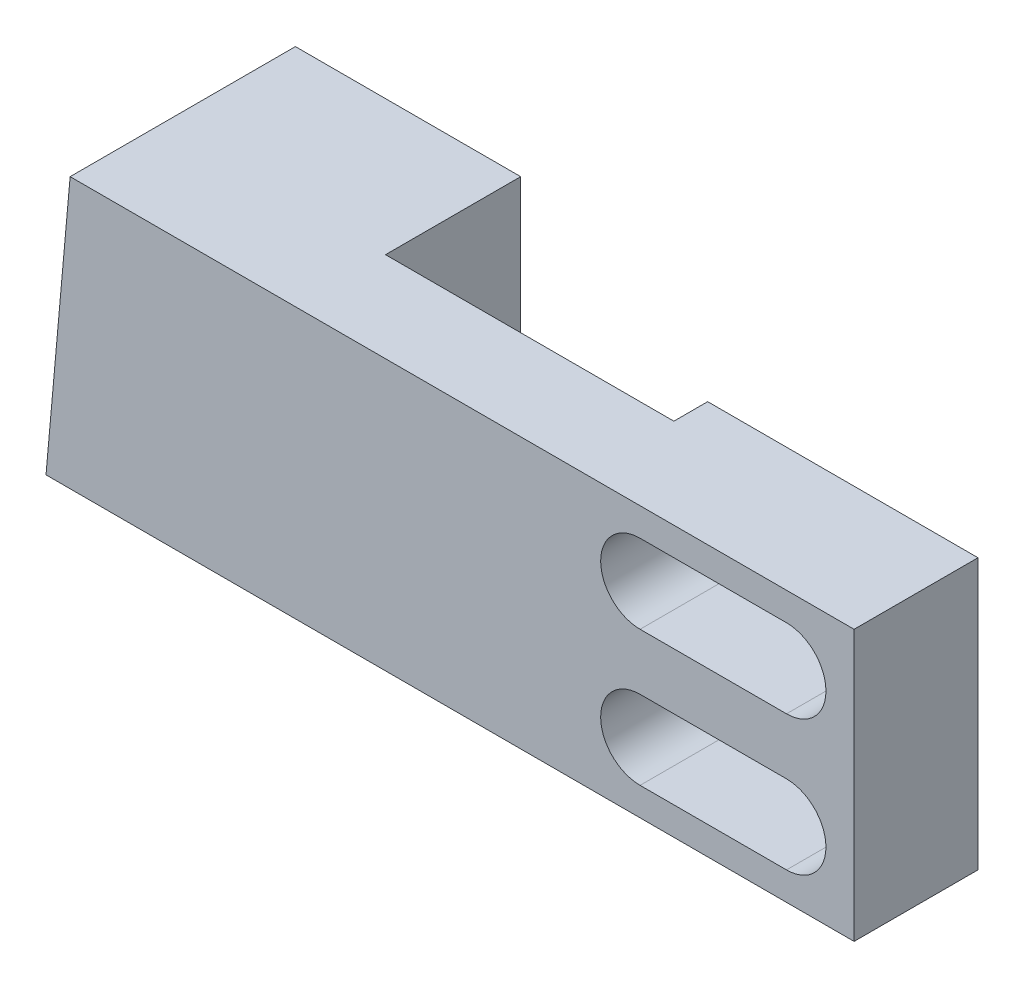
ISO-10303-21;
HEADER;
FILE_DESCRIPTION(('STEP AP214'),'2;1');
FILE_NAME('part.step','',(''),(''),'','','');
FILE_SCHEMA(('AUTOMOTIVE_DESIGN { 1 0 10303 214 1 1 1 1 }'));
ENDSEC;
DATA;
#1=APPLICATION_CONTEXT('core data for automotive mechanical design processes');
#2=APPLICATION_PROTOCOL_DEFINITION('international standard','automotive_design',2000,#1);
#3=PRODUCT_CONTEXT('',#1,'mechanical');
#4=PRODUCT('Part','Part','',(#3));
#5=PRODUCT_RELATED_PRODUCT_CATEGORY('part','',(#4));
#6=PRODUCT_DEFINITION_FORMATION('','',#4);
#7=PRODUCT_DEFINITION_CONTEXT('part definition',#1,'design');
#8=PRODUCT_DEFINITION('design','',#6,#7);
#9=PRODUCT_DEFINITION_SHAPE('','',#8);
#10=(LENGTH_UNIT() NAMED_UNIT(*) SI_UNIT(.MILLI.,.METRE.));
#11=(NAMED_UNIT(*) PLANE_ANGLE_UNIT() SI_UNIT($,.RADIAN.));
#12=(NAMED_UNIT(*) SI_UNIT($,.STERADIAN.) SOLID_ANGLE_UNIT());
#13=UNCERTAINTY_MEASURE_WITH_UNIT(LENGTH_MEASURE(1.E-05),#10,'distance_accuracy_value','');
#14=(GEOMETRIC_REPRESENTATION_CONTEXT(3) GLOBAL_UNCERTAINTY_ASSIGNED_CONTEXT((#13)) GLOBAL_UNIT_ASSIGNED_CONTEXT((#10,
#11,#12)) REPRESENTATION_CONTEXT('',''));
#15=CARTESIAN_POINT('',(0.,0.,0.));
#16=DIRECTION('',(0.,0.,1.));
#17=DIRECTION('',(1.,0.,0.));
#18=AXIS2_PLACEMENT_3D('',#15,#16,#17);
#19=CARTESIAN_POINT('',(0.,0.,6.));
#20=DIRECTION('',(0.,0.,1.));
#21=DIRECTION('',(1.,0.,0.));
#22=AXIS2_PLACEMENT_3D('',#19,#20,#21);
#23=PLANE('',#22);
#24=DIRECTION('',(0.,1.,0.));
#25=VECTOR('',#24,1.);
#26=CARTESIAN_POINT('',(12.8,12.,6.));
#27=LINE('',#26,#25);
#28=CARTESIAN_POINT('',(12.8,0.,6.));
#29=VERTEX_POINT('',#28);
#30=CARTESIAN_POINT('',(12.8,12.,6.));
#31=VERTEX_POINT('',#30);
#32=EDGE_CURVE('E190',#29,#31,#27,.T.);
#33=ORIENTED_EDGE('',*,*,#32,.F.);
#34=DIRECTION('',(1.,0.,0.));
#35=VECTOR('',#34,1.);
#36=CARTESIAN_POINT('',(0.,0.,6.));
#37=LINE('',#36,#35);
#38=CARTESIAN_POINT('',(0.,0.,6.));
#39=VERTEX_POINT('',#38);
#40=EDGE_CURVE('E222',#39,#29,#37,.T.);
#41=ORIENTED_EDGE('',*,*,#40,.F.);
#42=DIRECTION('',(0.,-1.,0.));
#43=VECTOR('',#42,1.);
#44=CARTESIAN_POINT('',(0.,12.,6.));
#45=LINE('',#44,#43);
#46=CARTESIAN_POINT('',(0.,12.,6.));
#47=VERTEX_POINT('',#46);
#48=EDGE_CURVE('E218',#47,#39,#45,.T.);
#49=ORIENTED_EDGE('',*,*,#48,.F.);
#50=DIRECTION('',(-1.,0.,0.));
#51=VECTOR('',#50,1.);
#52=CARTESIAN_POINT('',(0.,12.,6.));
#53=LINE('',#52,#51);
#54=EDGE_CURVE('E228',#31,#47,#53,.T.);
#55=ORIENTED_EDGE('',*,*,#54,.F.);
#56=EDGE_LOOP('',(#33,#41,#49,#55));
#57=FACE_BOUND('',#56,.T.);
#58=ADVANCED_FACE('F36',(#57),#23,.F.);
#59=CARTESIAN_POINT('',(-11.0709714683876,0.,10.));
#60=DIRECTION('',(0.,1.,0.));
#61=DIRECTION('',(-1.,0.,0.));
#62=AXIS2_PLACEMENT_3D('',#59,#60,#61);
#63=PLANE('',#62);
#64=DIRECTION('',(1.,0.,0.));
#65=VECTOR('',#64,1.);
#66=CARTESIAN_POINT('',(-11.0709714683876,0.,0.));
#67=LINE('',#66,#65);
#68=CARTESIAN_POINT('',(-11.0709714683876,0.,0.));
#69=VERTEX_POINT('',#68);
#70=CARTESIAN_POINT('',(0.,0.,0.));
#71=VERTEX_POINT('',#70);
#72=EDGE_CURVE('E327',#69,#71,#67,.T.);
#73=ORIENTED_EDGE('',*,*,#72,.T.);
#74=DIRECTION('',(0.,0.,-1.));
#75=VECTOR('',#74,1.);
#76=CARTESIAN_POINT('',(0.,0.,10.));
#77=LINE('',#76,#75);
#78=EDGE_CURVE('E223',#39,#71,#77,.T.);
#79=ORIENTED_EDGE('',*,*,#78,.F.);
#80=ORIENTED_EDGE('',*,*,#40,.T.);
#81=DIRECTION('',(0.,0.,1.));
#82=VECTOR('',#81,1.);
#83=CARTESIAN_POINT('',(12.8,0.,4.5));
#84=LINE('',#83,#82);
#85=CARTESIAN_POINT('',(12.8,0.,4.5));
#86=VERTEX_POINT('',#85);
#87=EDGE_CURVE('E211',#86,#29,#84,.T.);
#88=ORIENTED_EDGE('',*,*,#87,.F.);
#89=DIRECTION('',(-1.,0.,0.));
#90=VECTOR('',#89,1.);
#91=CARTESIAN_POINT('',(24.8,0.,4.5));
#92=LINE('',#91,#90);
#93=CARTESIAN_POINT('',(24.8,0.,4.5));
#94=VERTEX_POINT('',#93);
#95=EDGE_CURVE('E200',#94,#86,#92,.T.);
#96=ORIENTED_EDGE('',*,*,#95,.F.);
#97=DIRECTION('',(0.,0.,1.));
#98=VECTOR('',#97,1.);
#99=CARTESIAN_POINT('',(24.8,0.,6.));
#100=LINE('',#99,#98);
#101=CARTESIAN_POINT('',(24.8,0.,10.));
#102=VERTEX_POINT('',#101);
#103=EDGE_CURVE('E234',#94,#102,#100,.T.);
#104=ORIENTED_EDGE('',*,*,#103,.T.);
#105=DIRECTION('',(1.,0.,0.));
#106=VECTOR('',#105,1.);
#107=CARTESIAN_POINT('',(-11.0709714683876,0.,10.));
#108=LINE('',#107,#106);
#109=CARTESIAN_POINT('',(-11.0709714683876,0.,10.));
#110=VERTEX_POINT('',#109);
#111=EDGE_CURVE('E323',#110,#102,#108,.T.);
#112=ORIENTED_EDGE('',*,*,#111,.F.);
#113=DIRECTION('',(0.,0.,-1.));
#114=VECTOR('',#113,1.);
#115=CARTESIAN_POINT('',(-11.0709714683876,0.,10.));
#116=LINE('',#115,#114);
#117=EDGE_CURVE('E312',#110,#69,#116,.T.);
#118=ORIENTED_EDGE('',*,*,#117,.T.);
#119=EDGE_LOOP('',(#73,#79,#80,#88,#96,#104,#112,#118));
#120=FACE_BOUND('',#119,.T.);
#121=ADVANCED_FACE('F38',(#120),#63,.F.);
#122=CARTESIAN_POINT('',(0.,0.,10.));
#123=DIRECTION('',(-1.,0.,0.));
#124=DIRECTION('',(0.,0.,1.));
#125=AXIS2_PLACEMENT_3D('',#122,#123,#124);
#126=PLANE('',#125);
#127=DIRECTION('',(0.,0.,-1.));
#128=VECTOR('',#127,1.);
#129=CARTESIAN_POINT('',(0.,12.,10.));
#130=LINE('',#129,#128);
#131=CARTESIAN_POINT('',(0.,12.,0.));
#132=VERTEX_POINT('',#131);
#133=EDGE_CURVE('E304',#47,#132,#130,.T.);
#134=ORIENTED_EDGE('',*,*,#133,.F.);
#135=ORIENTED_EDGE('',*,*,#48,.T.);
#136=ORIENTED_EDGE('',*,*,#78,.T.);
#137=DIRECTION('',(0.,1.,0.));
#138=VECTOR('',#137,1.);
#139=CARTESIAN_POINT('',(0.,0.,0.));
#140=LINE('',#139,#138);
#141=EDGE_CURVE('E308',#71,#132,#140,.T.);
#142=ORIENTED_EDGE('',*,*,#141,.T.);
#143=EDGE_LOOP('',(#134,#135,#136,#142));
#144=FACE_BOUND('',#143,.T.);
#145=ADVANCED_FACE('F274',(#144),#126,.F.);
#146=CARTESIAN_POINT('',(0.,12.,10.));
#147=DIRECTION('',(0.,-1.,0.));
#148=DIRECTION('',(0.,0.,-1.));
#149=AXIS2_PLACEMENT_3D('',#146,#147,#148);
#150=PLANE('',#149);
#151=DIRECTION('',(-1.,0.,0.));
#152=VECTOR('',#151,1.);
#153=CARTESIAN_POINT('',(0.,12.,0.));
#154=LINE('',#153,#152);
#155=CARTESIAN_POINT('',(-10.,12.,0.));
#156=VERTEX_POINT('',#155);
#157=EDGE_CURVE('E324',#132,#156,#154,.T.);
#158=ORIENTED_EDGE('',*,*,#157,.T.);
#159=DIRECTION('',(0.,0.,-1.));
#160=VECTOR('',#159,1.);
#161=CARTESIAN_POINT('',(-10.,12.,10.));
#162=LINE('',#161,#160);
#163=CARTESIAN_POINT('',(-10.,12.,10.));
#164=VERTEX_POINT('',#163);
#165=EDGE_CURVE('E310',#164,#156,#162,.T.);
#166=ORIENTED_EDGE('',*,*,#165,.F.);
#167=DIRECTION('',(-1.,0.,0.));
#168=VECTOR('',#167,1.);
#169=CARTESIAN_POINT('',(0.,12.,10.));
#170=LINE('',#169,#168);
#171=CARTESIAN_POINT('',(24.8,12.,10.));
#172=VERTEX_POINT('',#171);
#173=EDGE_CURVE('E332',#172,#164,#170,.T.);
#174=ORIENTED_EDGE('',*,*,#173,.F.);
#175=DIRECTION('',(0.,0.,1.));
#176=VECTOR('',#175,1.);
#177=CARTESIAN_POINT('',(24.8,12.,6.));
#178=LINE('',#177,#176);
#179=CARTESIAN_POINT('',(24.8,12.,4.5));
#180=VERTEX_POINT('',#179);
#181=EDGE_CURVE('E330',#180,#172,#178,.T.);
#182=ORIENTED_EDGE('',*,*,#181,.F.);
#183=DIRECTION('',(1.,0.,0.));
#184=VECTOR('',#183,1.);
#185=CARTESIAN_POINT('',(24.8,12.,4.5));
#186=LINE('',#185,#184);
#187=CARTESIAN_POINT('',(12.8,12.,4.5));
#188=VERTEX_POINT('',#187);
#189=EDGE_CURVE('E204',#188,#180,#186,.T.);
#190=ORIENTED_EDGE('',*,*,#189,.F.);
#191=DIRECTION('',(0.,0.,1.));
#192=VECTOR('',#191,1.);
#193=CARTESIAN_POINT('',(12.8,12.,4.5));
#194=LINE('',#193,#192);
#195=EDGE_CURVE('E207',#188,#31,#194,.T.);
#196=ORIENTED_EDGE('',*,*,#195,.T.);
#197=ORIENTED_EDGE('',*,*,#54,.T.);
#198=ORIENTED_EDGE('',*,*,#133,.T.);
#199=EDGE_LOOP('',(#158,#166,#174,#182,#190,#196,#197,#198));
#200=FACE_BOUND('',#199,.T.);
#201=ADVANCED_FACE('F294',(#200),#150,.F.);
#202=CARTESIAN_POINT('',(-10.,12.,10.));
#203=DIRECTION('',(0.996041065410769,-0.0888942968664453,0.));
#204=DIRECTION('',(0.0888942968664453,0.996041065410769,0.));
#205=AXIS2_PLACEMENT_3D('',#202,#203,#204);
#206=PLANE('',#205);
#207=DIRECTION('',(-0.0888942968664453,-0.996041065410769,0.));
#208=VECTOR('',#207,1.);
#209=CARTESIAN_POINT('',(-10.,12.,0.));
#210=LINE('',#209,#208);
#211=EDGE_CURVE('E321',#156,#69,#210,.T.);
#212=ORIENTED_EDGE('',*,*,#211,.T.);
#213=ORIENTED_EDGE('',*,*,#117,.F.);
#214=DIRECTION('',(-0.0888942968664453,-0.996041065410769,0.));
#215=VECTOR('',#214,1.);
#216=CARTESIAN_POINT('',(-10.,12.,10.));
#217=LINE('',#216,#215);
#218=EDGE_CURVE('E320',#164,#110,#217,.T.);
#219=ORIENTED_EDGE('',*,*,#218,.F.);
#220=ORIENTED_EDGE('',*,*,#165,.T.);
#221=EDGE_LOOP('',(#212,#213,#219,#220));
#222=FACE_BOUND('',#221,.T.);
#223=ADVANCED_FACE('F288',(#222),#206,.F.);
#224=CARTESIAN_POINT('',(0.,0.,10.));
#225=DIRECTION('',(0.,0.,1.));
#226=DIRECTION('',(1.,0.,0.));
#227=AXIS2_PLACEMENT_3D('',#224,#225,#226);
#228=PLANE('',#227);
#229=CARTESIAN_POINT('',(21.8,3.00000000000012,10.));
#230=DIRECTION('',(0.,0.,1.));
#231=DIRECTION('',(-1.,0.,0.));
#232=AXIS2_PLACEMENT_3D('',#229,#230,#231);
#233=CIRCLE('',#232,1.75);
#234=CARTESIAN_POINT('',(21.8,1.25000000000012,10.));
#235=VERTEX_POINT('',#234);
#236=CARTESIAN_POINT('',(21.8,4.75000000000012,10.));
#237=VERTEX_POINT('',#236);
#238=EDGE_CURVE('E51',#235,#237,#233,.T.);
#239=ORIENTED_EDGE('',*,*,#238,.F.);
#240=DIRECTION('',(1.,0.,0.));
#241=VECTOR('',#240,1.);
#242=CARTESIAN_POINT('',(21.8,1.25000000000012,10.));
#243=LINE('',#242,#241);
#244=CARTESIAN_POINT('',(15.3,1.25000000000012,10.));
#245=VERTEX_POINT('',#244);
#246=EDGE_CURVE('E167',#245,#235,#243,.T.);
#247=ORIENTED_EDGE('',*,*,#246,.F.);
#248=CARTESIAN_POINT('',(15.3,3.00000000000012,10.));
#249=DIRECTION('',(0.,0.,1.));
#250=DIRECTION('',(-1.,0.,0.));
#251=AXIS2_PLACEMENT_3D('',#248,#249,#250);
#252=CIRCLE('',#251,1.75);
#253=CARTESIAN_POINT('',(15.3,4.75000000000012,10.));
#254=VERTEX_POINT('',#253);
#255=EDGE_CURVE('E151',#254,#245,#252,.T.);
#256=ORIENTED_EDGE('',*,*,#255,.F.);
#257=DIRECTION('',(-1.,0.,0.));
#258=VECTOR('',#257,1.);
#259=CARTESIAN_POINT('',(21.8,4.75000000000012,10.));
#260=LINE('',#259,#258);
#261=EDGE_CURVE('E160',#237,#254,#260,.T.);
#262=ORIENTED_EDGE('',*,*,#261,.F.);
#263=EDGE_LOOP('',(#239,#247,#256,#262));
#264=FACE_BOUND('',#263,.T.);
#265=CARTESIAN_POINT('',(21.8,8.99999999999988,10.));
#266=DIRECTION('',(0.,0.,1.));
#267=DIRECTION('',(1.,0.,0.));
#268=AXIS2_PLACEMENT_3D('',#265,#266,#267);
#269=CIRCLE('',#268,1.75);
#270=CARTESIAN_POINT('',(21.8,7.24999999999988,10.));
#271=VERTEX_POINT('',#270);
#272=CARTESIAN_POINT('',(21.8,10.7499999999999,10.));
#273=VERTEX_POINT('',#272);
#274=EDGE_CURVE('E174',#271,#273,#269,.T.);
#275=ORIENTED_EDGE('',*,*,#274,.F.);
#276=DIRECTION('',(1.,0.,0.));
#277=VECTOR('',#276,1.);
#278=CARTESIAN_POINT('',(21.8,7.24999999999988,10.));
#279=LINE('',#278,#277);
#280=CARTESIAN_POINT('',(15.3,7.24999999999988,10.));
#281=VERTEX_POINT('',#280);
#282=EDGE_CURVE('E184',#281,#271,#279,.T.);
#283=ORIENTED_EDGE('',*,*,#282,.F.);
#284=CARTESIAN_POINT('',(15.3,8.99999999999988,10.));
#285=DIRECTION('',(0.,0.,1.));
#286=DIRECTION('',(1.,0.,0.));
#287=AXIS2_PLACEMENT_3D('',#284,#285,#286);
#288=CIRCLE('',#287,1.75);
#289=CARTESIAN_POINT('',(15.3,10.7499999999999,10.));
#290=VERTEX_POINT('',#289);
#291=EDGE_CURVE('E181',#290,#281,#288,.T.);
#292=ORIENTED_EDGE('',*,*,#291,.F.);
#293=DIRECTION('',(-1.,0.,0.));
#294=VECTOR('',#293,1.);
#295=CARTESIAN_POINT('',(21.8,10.7499999999999,10.));
#296=LINE('',#295,#294);
#297=EDGE_CURVE('E178',#273,#290,#296,.T.);
#298=ORIENTED_EDGE('',*,*,#297,.F.);
#299=EDGE_LOOP('',(#275,#283,#292,#298));
#300=FACE_BOUND('',#299,.T.);
#301=ORIENTED_EDGE('',*,*,#111,.T.);
#302=DIRECTION('',(0.,1.,0.));
#303=VECTOR('',#302,1.);
#304=CARTESIAN_POINT('',(24.8,12.,10.));
#305=LINE('',#304,#303);
#306=EDGE_CURVE('E213',#102,#172,#305,.T.);
#307=ORIENTED_EDGE('',*,*,#306,.T.);
#308=ORIENTED_EDGE('',*,*,#173,.T.);
#309=ORIENTED_EDGE('',*,*,#218,.T.);
#310=EDGE_LOOP('',(#301,#307,#308,#309));
#311=FACE_BOUND('',#310,.T.);
#312=ADVANCED_FACE('F164',(#264,#300,#311),#228,.T.);
#313=CARTESIAN_POINT('',(0.,0.,0.));
#314=DIRECTION('',(0.,0.,1.));
#315=DIRECTION('',(1.,0.,0.));
#316=AXIS2_PLACEMENT_3D('',#313,#314,#315);
#317=PLANE('',#316);
#318=ORIENTED_EDGE('',*,*,#72,.F.);
#319=ORIENTED_EDGE('',*,*,#211,.F.);
#320=ORIENTED_EDGE('',*,*,#157,.F.);
#321=ORIENTED_EDGE('',*,*,#141,.F.);
#322=EDGE_LOOP('',(#318,#319,#320,#321));
#323=FACE_BOUND('',#322,.T.);
#324=ADVANCED_FACE('F284',(#323),#317,.F.);
#325=CARTESIAN_POINT('',(24.8,12.,6.));
#326=DIRECTION('',(1.,0.,0.));
#327=DIRECTION('',(0.,0.,-1.));
#328=AXIS2_PLACEMENT_3D('',#325,#326,#327);
#329=PLANE('',#328);
#330=ORIENTED_EDGE('',*,*,#306,.F.);
#331=ORIENTED_EDGE('',*,*,#103,.F.);
#332=DIRECTION('',(0.,-1.,0.));
#333=VECTOR('',#332,1.);
#334=CARTESIAN_POINT('',(24.8,12.,4.5));
#335=LINE('',#334,#333);
#336=EDGE_CURVE('E197',#180,#94,#335,.T.);
#337=ORIENTED_EDGE('',*,*,#336,.F.);
#338=ORIENTED_EDGE('',*,*,#181,.T.);
#339=EDGE_LOOP('',(#330,#331,#337,#338));
#340=FACE_BOUND('',#339,.T.);
#341=ADVANCED_FACE('F281',(#340),#329,.T.);
#342=CARTESIAN_POINT('',(12.8,12.,4.5));
#343=DIRECTION('',(1.,0.,0.));
#344=DIRECTION('',(0.,1.,0.));
#345=AXIS2_PLACEMENT_3D('',#342,#343,#344);
#346=PLANE('',#345);
#347=ORIENTED_EDGE('',*,*,#32,.T.);
#348=ORIENTED_EDGE('',*,*,#195,.F.);
#349=DIRECTION('',(0.,1.,0.));
#350=VECTOR('',#349,1.);
#351=CARTESIAN_POINT('',(12.8,12.,4.5));
#352=LINE('',#351,#350);
#353=EDGE_CURVE('E202',#86,#188,#352,.T.);
#354=ORIENTED_EDGE('',*,*,#353,.F.);
#355=ORIENTED_EDGE('',*,*,#87,.T.);
#356=EDGE_LOOP('',(#347,#348,#354,#355));
#357=FACE_BOUND('',#356,.T.);
#358=ADVANCED_FACE('F279',(#357),#346,.F.);
#359=CARTESIAN_POINT('',(24.8,0.,4.5));
#360=DIRECTION('',(0.,0.,-1.));
#361=DIRECTION('',(-1.,0.,0.));
#362=AXIS2_PLACEMENT_3D('',#359,#360,#361);
#363=PLANE('',#362);
#364=CARTESIAN_POINT('',(21.8,3.00000000000012,4.5));
#365=DIRECTION('',(0.,0.,-1.));
#366=DIRECTION('',(-1.,0.,0.));
#367=AXIS2_PLACEMENT_3D('',#364,#365,#366);
#368=CIRCLE('',#367,1.75);
#369=CARTESIAN_POINT('',(21.8,4.75000000000012,4.5));
#370=VERTEX_POINT('',#369);
#371=CARTESIAN_POINT('',(21.8,1.25000000000012,4.5));
#372=VERTEX_POINT('',#371);
#373=EDGE_CURVE('E11',#370,#372,#368,.T.);
#374=ORIENTED_EDGE('',*,*,#373,.F.);
#375=DIRECTION('',(1.,0.,0.));
#376=VECTOR('',#375,1.);
#377=CARTESIAN_POINT('',(24.8,4.75000000000012,4.5));
#378=LINE('',#377,#376);
#379=CARTESIAN_POINT('',(15.3,4.75000000000012,4.5));
#380=VERTEX_POINT('',#379);
#381=EDGE_CURVE('E244',#380,#370,#378,.T.);
#382=ORIENTED_EDGE('',*,*,#381,.F.);
#383=CARTESIAN_POINT('',(15.3,3.00000000000012,4.5));
#384=DIRECTION('',(0.,0.,-1.));
#385=DIRECTION('',(-1.,0.,0.));
#386=AXIS2_PLACEMENT_3D('',#383,#384,#385);
#387=CIRCLE('',#386,1.75);
#388=CARTESIAN_POINT('',(15.3,1.25000000000012,4.5));
#389=VERTEX_POINT('',#388);
#390=EDGE_CURVE('E154',#389,#380,#387,.T.);
#391=ORIENTED_EDGE('',*,*,#390,.F.);
#392=DIRECTION('',(-1.,0.,0.));
#393=VECTOR('',#392,1.);
#394=CARTESIAN_POINT('',(24.8,1.25000000000012,4.5));
#395=LINE('',#394,#393);
#396=EDGE_CURVE('E44',#372,#389,#395,.T.);
#397=ORIENTED_EDGE('',*,*,#396,.F.);
#398=EDGE_LOOP('',(#374,#382,#391,#397));
#399=FACE_BOUND('',#398,.T.);
#400=CARTESIAN_POINT('',(21.8,8.99999999999988,4.5));
#401=DIRECTION('',(0.,0.,-1.));
#402=DIRECTION('',(-1.,0.,0.));
#403=AXIS2_PLACEMENT_3D('',#400,#401,#402);
#404=CIRCLE('',#403,1.75);
#405=CARTESIAN_POINT('',(21.8,10.7499999999999,4.5));
#406=VERTEX_POINT('',#405);
#407=CARTESIAN_POINT('',(21.8,7.24999999999988,4.5));
#408=VERTEX_POINT('',#407);
#409=EDGE_CURVE('E242',#406,#408,#404,.T.);
#410=ORIENTED_EDGE('',*,*,#409,.F.);
#411=DIRECTION('',(1.,0.,0.));
#412=VECTOR('',#411,1.);
#413=CARTESIAN_POINT('',(24.8,10.7499999999999,4.5));
#414=LINE('',#413,#412);
#415=CARTESIAN_POINT('',(15.3,10.7499999999999,4.5));
#416=VERTEX_POINT('',#415);
#417=EDGE_CURVE('E235',#416,#406,#414,.T.);
#418=ORIENTED_EDGE('',*,*,#417,.F.);
#419=CARTESIAN_POINT('',(15.3,8.99999999999988,4.5));
#420=DIRECTION('',(0.,0.,-1.));
#421=DIRECTION('',(-1.,0.,0.));
#422=AXIS2_PLACEMENT_3D('',#419,#420,#421);
#423=CIRCLE('',#422,1.75);
#424=CARTESIAN_POINT('',(15.3,7.24999999999988,4.5));
#425=VERTEX_POINT('',#424);
#426=EDGE_CURVE('E237',#425,#416,#423,.T.);
#427=ORIENTED_EDGE('',*,*,#426,.F.);
#428=DIRECTION('',(-1.,0.,0.));
#429=VECTOR('',#428,1.);
#430=CARTESIAN_POINT('',(24.8,7.24999999999988,4.5));
#431=LINE('',#430,#429);
#432=EDGE_CURVE('E240',#408,#425,#431,.T.);
#433=ORIENTED_EDGE('',*,*,#432,.F.);
#434=EDGE_LOOP('',(#410,#418,#427,#433));
#435=FACE_BOUND('',#434,.T.);
#436=ORIENTED_EDGE('',*,*,#336,.T.);
#437=ORIENTED_EDGE('',*,*,#95,.T.);
#438=ORIENTED_EDGE('',*,*,#353,.T.);
#439=ORIENTED_EDGE('',*,*,#189,.T.);
#440=EDGE_LOOP('',(#436,#437,#438,#439));
#441=FACE_BOUND('',#440,.T.);
#442=ADVANCED_FACE('F252',(#399,#435,#441),#363,.T.);
#443=CARTESIAN_POINT('',(21.8,8.99999999999988,-2.50000000007189E-05));
#444=DIRECTION('',(0.,0.,1.));
#445=DIRECTION('',(1.,0.,0.));
#446=AXIS2_PLACEMENT_3D('',#443,#444,#445);
#447=CYLINDRICAL_SURFACE('',#446,1.75);
#448=ORIENTED_EDGE('',*,*,#409,.T.);
#449=DIRECTION('',(0.,0.,1.));
#450=VECTOR('',#449,1.);
#451=CARTESIAN_POINT('',(21.8,7.24999999999988,-2.50000000007189E-05));
#452=LINE('',#451,#450);
#453=EDGE_CURVE('E188',#408,#271,#452,.T.);
#454=ORIENTED_EDGE('',*,*,#453,.T.);
#455=ORIENTED_EDGE('',*,*,#274,.T.);
#456=DIRECTION('',(0.,0.,1.));
#457=VECTOR('',#456,1.);
#458=CARTESIAN_POINT('',(21.8,10.7499999999999,-2.50000000007189E-05));
#459=LINE('',#458,#457);
#460=EDGE_CURVE('E187',#406,#273,#459,.T.);
#461=ORIENTED_EDGE('',*,*,#460,.F.);
#462=EDGE_LOOP('',(#448,#454,#455,#461));
#463=FACE_BOUND('',#462,.T.);
#464=ADVANCED_FACE('F359',(#463),#447,.F.);
#465=CARTESIAN_POINT('',(21.8,7.24999999999988,-2.50000000007189E-05));
#466=DIRECTION('',(0.,-1.,0.));
#467=DIRECTION('',(0.,0.,-1.));
#468=AXIS2_PLACEMENT_3D('',#465,#466,#467);
#469=PLANE('',#468);
#470=ORIENTED_EDGE('',*,*,#432,.T.);
#471=DIRECTION('',(0.,0.,1.));
#472=VECTOR('',#471,1.);
#473=CARTESIAN_POINT('',(15.3,7.24999999999988,-2.50000000007189E-05));
#474=LINE('',#473,#472);
#475=EDGE_CURVE('E191',#425,#281,#474,.T.);
#476=ORIENTED_EDGE('',*,*,#475,.T.);
#477=ORIENTED_EDGE('',*,*,#282,.T.);
#478=ORIENTED_EDGE('',*,*,#453,.F.);
#479=EDGE_LOOP('',(#470,#476,#477,#478));
#480=FACE_BOUND('',#479,.T.);
#481=ADVANCED_FACE('F363',(#480),#469,.F.);
#482=CARTESIAN_POINT('',(15.3,8.99999999999988,-2.50000000007189E-05));
#483=DIRECTION('',(0.,0.,1.));
#484=DIRECTION('',(1.,0.,0.));
#485=AXIS2_PLACEMENT_3D('',#482,#483,#484);
#486=CYLINDRICAL_SURFACE('',#485,1.75);
#487=ORIENTED_EDGE('',*,*,#426,.T.);
#488=DIRECTION('',(0.,0.,1.));
#489=VECTOR('',#488,1.);
#490=CARTESIAN_POINT('',(15.3,10.7499999999999,-2.50000000007189E-05));
#491=LINE('',#490,#489);
#492=EDGE_CURVE('E193',#416,#290,#491,.T.);
#493=ORIENTED_EDGE('',*,*,#492,.T.);
#494=ORIENTED_EDGE('',*,*,#291,.T.);
#495=ORIENTED_EDGE('',*,*,#475,.F.);
#496=EDGE_LOOP('',(#487,#493,#494,#495));
#497=FACE_BOUND('',#496,.T.);
#498=ADVANCED_FACE('F263',(#497),#486,.F.);
#499=CARTESIAN_POINT('',(21.8,10.7499999999999,-2.50000000007189E-05));
#500=DIRECTION('',(0.,1.,0.));
#501=DIRECTION('',(-1.,0.,0.));
#502=AXIS2_PLACEMENT_3D('',#499,#500,#501);
#503=PLANE('',#502);
#504=ORIENTED_EDGE('',*,*,#417,.T.);
#505=ORIENTED_EDGE('',*,*,#460,.T.);
#506=ORIENTED_EDGE('',*,*,#297,.T.);
#507=ORIENTED_EDGE('',*,*,#492,.F.);
#508=EDGE_LOOP('',(#504,#505,#506,#507));
#509=FACE_BOUND('',#508,.T.);
#510=ADVANCED_FACE('F256',(#509),#503,.F.);
#511=CARTESIAN_POINT('',(21.8,3.00000000000012,-2.50000000007189E-05));
#512=DIRECTION('',(0.,0.,1.));
#513=DIRECTION('',(1.,0.,0.));
#514=AXIS2_PLACEMENT_3D('',#511,#512,#513);
#515=CYLINDRICAL_SURFACE('',#514,1.75);
#516=ORIENTED_EDGE('',*,*,#373,.T.);
#517=DIRECTION('',(0.,0.,1.));
#518=VECTOR('',#517,1.);
#519=CARTESIAN_POINT('',(21.8,1.25000000000012,-2.50000000007189E-05));
#520=LINE('',#519,#518);
#521=EDGE_CURVE('E172',#372,#235,#520,.T.);
#522=ORIENTED_EDGE('',*,*,#521,.T.);
#523=ORIENTED_EDGE('',*,*,#238,.T.);
#524=DIRECTION('',(0.,0.,1.));
#525=VECTOR('',#524,1.);
#526=CARTESIAN_POINT('',(21.8,4.75000000000012,-2.50000000007189E-05));
#527=LINE('',#526,#525);
#528=EDGE_CURVE('E157',#370,#237,#527,.T.);
#529=ORIENTED_EDGE('',*,*,#528,.F.);
#530=EDGE_LOOP('',(#516,#522,#523,#529));
#531=FACE_BOUND('',#530,.T.);
#532=ADVANCED_FACE('F254',(#531),#515,.F.);
#533=CARTESIAN_POINT('',(21.8,1.25000000000012,-2.50000000007189E-05));
#534=DIRECTION('',(0.,-1.,0.));
#535=DIRECTION('',(1.,0.,0.));
#536=AXIS2_PLACEMENT_3D('',#533,#534,#535);
#537=PLANE('',#536);
#538=ORIENTED_EDGE('',*,*,#396,.T.);
#539=DIRECTION('',(0.,0.,1.));
#540=VECTOR('',#539,1.);
#541=CARTESIAN_POINT('',(15.3,1.25000000000012,-2.50000000007189E-05));
#542=LINE('',#541,#540);
#543=EDGE_CURVE('E156',#389,#245,#542,.T.);
#544=ORIENTED_EDGE('',*,*,#543,.T.);
#545=ORIENTED_EDGE('',*,*,#246,.T.);
#546=ORIENTED_EDGE('',*,*,#521,.F.);
#547=EDGE_LOOP('',(#538,#544,#545,#546));
#548=FACE_BOUND('',#547,.T.);
#549=ADVANCED_FACE('F249',(#548),#537,.F.);
#550=CARTESIAN_POINT('',(15.3,3.00000000000012,-2.50000000007189E-05));
#551=DIRECTION('',(0.,0.,1.));
#552=DIRECTION('',(1.,0.,0.));
#553=AXIS2_PLACEMENT_3D('',#550,#551,#552);
#554=CYLINDRICAL_SURFACE('',#553,1.75);
#555=ORIENTED_EDGE('',*,*,#390,.T.);
#556=DIRECTION('',(0.,0.,1.));
#557=VECTOR('',#556,1.);
#558=CARTESIAN_POINT('',(15.3,4.75000000000012,-2.50000000007189E-05));
#559=LINE('',#558,#557);
#560=EDGE_CURVE('E59',#380,#254,#559,.T.);
#561=ORIENTED_EDGE('',*,*,#560,.T.);
#562=ORIENTED_EDGE('',*,*,#255,.T.);
#563=ORIENTED_EDGE('',*,*,#543,.F.);
#564=EDGE_LOOP('',(#555,#561,#562,#563));
#565=FACE_BOUND('',#564,.T.);
#566=ADVANCED_FACE('F148',(#565),#554,.F.);
#567=CARTESIAN_POINT('',(21.8,4.75000000000012,-2.50000000007189E-05));
#568=DIRECTION('',(0.,1.,0.));
#569=DIRECTION('',(0.,0.,1.));
#570=AXIS2_PLACEMENT_3D('',#567,#568,#569);
#571=PLANE('',#570);
#572=ORIENTED_EDGE('',*,*,#381,.T.);
#573=ORIENTED_EDGE('',*,*,#528,.T.);
#574=ORIENTED_EDGE('',*,*,#261,.T.);
#575=ORIENTED_EDGE('',*,*,#560,.F.);
#576=EDGE_LOOP('',(#572,#573,#574,#575));
#577=FACE_BOUND('',#576,.T.);
#578=ADVANCED_FACE('F161',(#577),#571,.F.);
#579=CLOSED_SHELL('',(#58,#121,#145,#201,#223,#312,#324,#341,#358,#442,#464,#481,#498,#510,#532,
#549,#566,#578));
#580=MANIFOLD_SOLID_BREP('B2',#579);
#581=ADVANCED_BREP_SHAPE_REPRESENTATION('',(#18,#580),#14);
#582=SHAPE_DEFINITION_REPRESENTATION(#9,#581);
ENDSEC;
END-ISO-10303-21;
